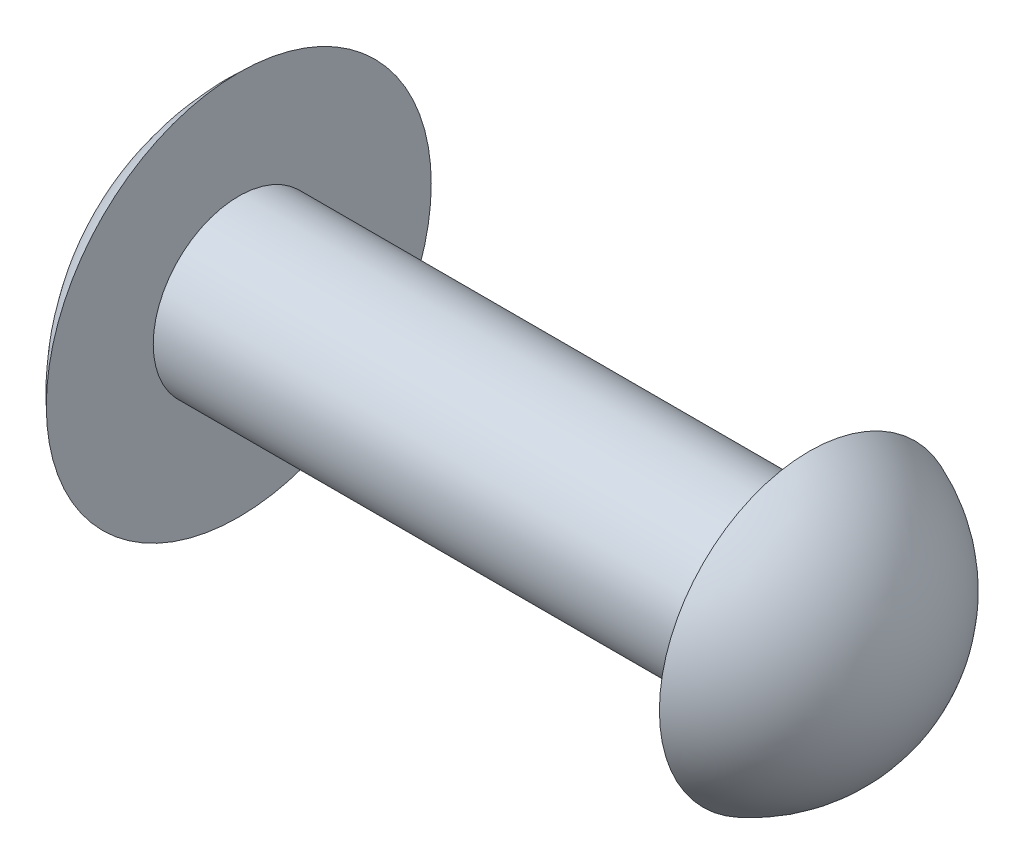
ISO-10303-21;
HEADER;
FILE_DESCRIPTION(('STEP AP214'),'2;1');
FILE_NAME('part.step','',(''),(''),'','','');
FILE_SCHEMA(('AUTOMOTIVE_DESIGN { 1 0 10303 214 1 1 1 1 }'));
ENDSEC;
DATA;
#1=APPLICATION_CONTEXT('core data for automotive mechanical design processes');
#2=APPLICATION_PROTOCOL_DEFINITION('international standard','automotive_design',2000,#1);
#3=PRODUCT_CONTEXT('',#1,'mechanical');
#4=PRODUCT('Part','Part','',(#3));
#5=PRODUCT_RELATED_PRODUCT_CATEGORY('part','',(#4));
#6=PRODUCT_DEFINITION_FORMATION('','',#4);
#7=PRODUCT_DEFINITION_CONTEXT('part definition',#1,'design');
#8=PRODUCT_DEFINITION('design','',#6,#7);
#9=PRODUCT_DEFINITION_SHAPE('','',#8);
#10=(LENGTH_UNIT() NAMED_UNIT(*) SI_UNIT(.MILLI.,.METRE.));
#11=(NAMED_UNIT(*) PLANE_ANGLE_UNIT() SI_UNIT($,.RADIAN.));
#12=(NAMED_UNIT(*) SI_UNIT($,.STERADIAN.) SOLID_ANGLE_UNIT());
#13=UNCERTAINTY_MEASURE_WITH_UNIT(LENGTH_MEASURE(1.E-05),#10,'distance_accuracy_value','');
#14=(GEOMETRIC_REPRESENTATION_CONTEXT(3) GLOBAL_UNCERTAINTY_ASSIGNED_CONTEXT((#13)) GLOBAL_UNIT_ASSIGNED_CONTEXT((#10,
#11,#12)) REPRESENTATION_CONTEXT('',''));
#15=CARTESIAN_POINT('',(0.,0.,0.));
#16=DIRECTION('',(0.,0.,1.));
#17=DIRECTION('',(1.,0.,0.));
#18=AXIS2_PLACEMENT_3D('',#15,#16,#17);
#19=CARTESIAN_POINT('',(-39.,0.,0.));
#20=DIRECTION('',(-1.,0.,0.));
#21=DIRECTION('',(0.,0.,1.));
#22=AXIS2_PLACEMENT_3D('',#19,#20,#21);
#23=CYLINDRICAL_SURFACE('',#22,3.);
#24=CARTESIAN_POINT('',(-20.,0.,0.));
#25=DIRECTION('',(-1.,0.,0.));
#26=DIRECTION('',(0.,0.,1.));
#27=AXIS2_PLACEMENT_3D('',#24,#25,#26);
#28=CIRCLE('',#27,3.);
#29=CARTESIAN_POINT('',(-20.,0.,3.));
#30=VERTEX_POINT('',#29);
#31=EDGE_CURVE('E10',#30,#30,#28,.T.);
#32=ORIENTED_EDGE('',*,*,#31,.F.);
#33=EDGE_LOOP('',(#32));
#34=FACE_BOUND('',#33,.T.);
#35=CARTESIAN_POINT('',(0.,0.,0.));
#36=DIRECTION('',(1.,0.,0.));
#37=DIRECTION('',(0.,0.,-1.));
#38=AXIS2_PLACEMENT_3D('',#35,#36,#37);
#39=CIRCLE('',#38,3.);
#40=CARTESIAN_POINT('',(0.,0.,-3.));
#41=VERTEX_POINT('',#40);
#42=EDGE_CURVE('E40',#41,#41,#39,.T.);
#43=ORIENTED_EDGE('',*,*,#42,.F.);
#44=EDGE_LOOP('',(#43));
#45=FACE_BOUND('',#44,.T.);
#46=ADVANCED_FACE('F30',(#34,#45),#23,.T.);
#47=CARTESIAN_POINT('',(-20.,3.,0.));
#48=DIRECTION('',(-1.,0.,0.));
#49=DIRECTION('',(0.,0.,1.));
#50=AXIS2_PLACEMENT_3D('',#47,#48,#49);
#51=PLANE('',#50);
#52=CARTESIAN_POINT('',(-20.,0.,0.));
#53=DIRECTION('',(-1.,0.,0.));
#54=DIRECTION('',(0.,0.,1.));
#55=AXIS2_PLACEMENT_3D('',#52,#53,#54);
#56=CIRCLE('',#55,6.75);
#57=CARTESIAN_POINT('',(-20.,0.,6.75));
#58=VERTEX_POINT('',#57);
#59=EDGE_CURVE('E36',#58,#58,#56,.T.);
#60=ORIENTED_EDGE('',*,*,#59,.F.);
#61=EDGE_LOOP('',(#60));
#62=FACE_BOUND('',#61,.T.);
#63=ORIENTED_EDGE('',*,*,#31,.T.);
#64=EDGE_LOOP('',(#63));
#65=FACE_BOUND('',#64,.T.);
#66=ADVANCED_FACE('F62',(#62,#65),#51,.F.);
#67=CARTESIAN_POINT('',(-13.90625,0.,0.));
#68=DIRECTION('',(-1.,0.,0.));
#69=DIRECTION('',(0.,1.,0.));
#70=AXIS2_PLACEMENT_3D('',#67,#68,#69);
#71=SPHERICAL_SURFACE('',#70,9.09374999999999);
#72=ORIENTED_EDGE('',*,*,#59,.T.);
#73=EDGE_LOOP('',(#72));
#74=FACE_BOUND('',#73,.T.);
#75=ADVANCED_FACE('F58',(#74),#71,.T.);
#76=CARTESIAN_POINT('',(0.,0.,0.));
#77=DIRECTION('',(1.,0.,0.));
#78=DIRECTION('',(0.,0.,-1.));
#79=AXIS2_PLACEMENT_3D('',#76,#77,#78);
#80=PLANE('',#79);
#81=ORIENTED_EDGE('',*,*,#42,.T.);
#82=EDGE_LOOP('',(#81));
#83=FACE_BOUND('',#82,.T.);
#84=CARTESIAN_POINT('',(0.,0.,0.));
#85=DIRECTION('',(-1.,0.,0.));
#86=DIRECTION('',(0.,0.,1.));
#87=AXIS2_PLACEMENT_3D('',#84,#85,#86);
#88=CIRCLE('',#87,5.25);
#89=CARTESIAN_POINT('',(0.,0.,5.25));
#90=VERTEX_POINT('',#89);
#91=EDGE_CURVE('E44',#90,#90,#88,.T.);
#92=ORIENTED_EDGE('',*,*,#91,.T.);
#93=EDGE_LOOP('',(#92));
#94=FACE_BOUND('',#93,.T.);
#95=ADVANCED_FACE('F50',(#83,#94),#80,.F.);
#96=CARTESIAN_POINT('',(-2.028125,0.,0.));
#97=DIRECTION('',(-1.,0.,0.));
#98=DIRECTION('',(0.,1.,0.));
#99=AXIS2_PLACEMENT_3D('',#96,#97,#98);
#100=SPHERICAL_SURFACE('',#99,5.628125);
#101=ORIENTED_EDGE('',*,*,#91,.F.);
#102=EDGE_LOOP('',(#101));
#103=FACE_BOUND('',#102,.T.);
#104=ADVANCED_FACE('F52',(#103),#100,.T.);
#105=CLOSED_SHELL('',(#46,#66,#75,#95,#104));
#106=MANIFOLD_SOLID_BREP('B2',#105);
#107=ADVANCED_BREP_SHAPE_REPRESENTATION('',(#18,#106),#14);
#108=SHAPE_DEFINITION_REPRESENTATION(#9,#107);
ENDSEC;
END-ISO-10303-21;
